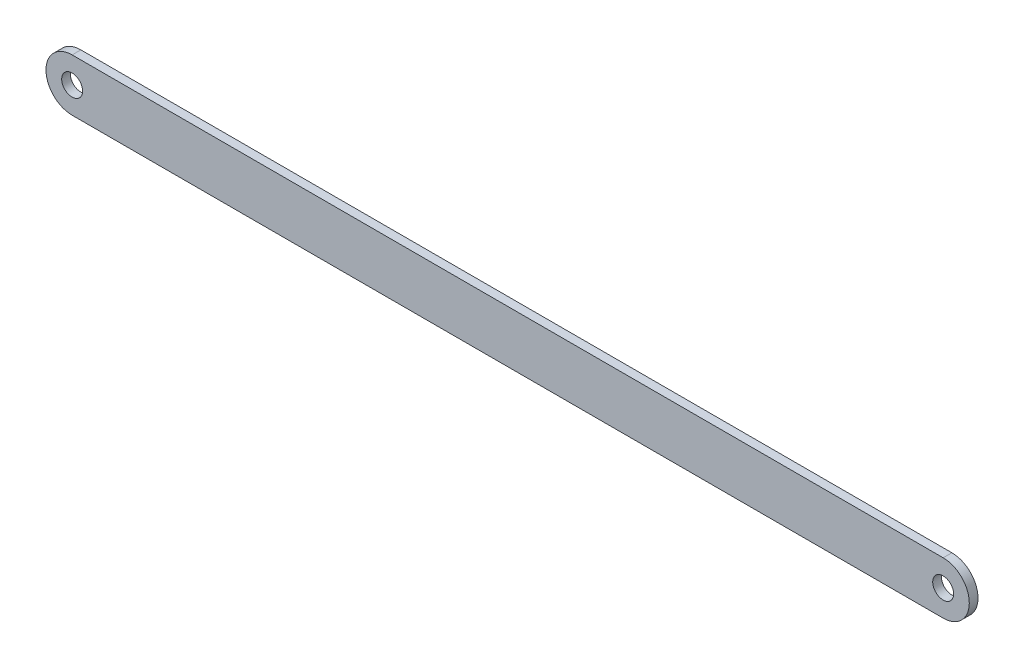
ISO-10303-21;
HEADER;
FILE_DESCRIPTION(('STEP AP214'),'2;1');
FILE_NAME('part.step','',(''),(''),'','','');
FILE_SCHEMA(('AUTOMOTIVE_DESIGN { 1 0 10303 214 1 1 1 1 }'));
ENDSEC;
DATA;
#1=APPLICATION_CONTEXT('core data for automotive mechanical design processes');
#2=APPLICATION_PROTOCOL_DEFINITION('international standard','automotive_design',2000,#1);
#3=PRODUCT_CONTEXT('',#1,'mechanical');
#4=PRODUCT('Part','Part','',(#3));
#5=PRODUCT_RELATED_PRODUCT_CATEGORY('part','',(#4));
#6=PRODUCT_DEFINITION_FORMATION('','',#4);
#7=PRODUCT_DEFINITION_CONTEXT('part definition',#1,'design');
#8=PRODUCT_DEFINITION('design','',#6,#7);
#9=PRODUCT_DEFINITION_SHAPE('','',#8);
#10=(LENGTH_UNIT() NAMED_UNIT(*) SI_UNIT(.MILLI.,.METRE.));
#11=(NAMED_UNIT(*) PLANE_ANGLE_UNIT() SI_UNIT($,.RADIAN.));
#12=(NAMED_UNIT(*) SI_UNIT($,.STERADIAN.) SOLID_ANGLE_UNIT());
#13=UNCERTAINTY_MEASURE_WITH_UNIT(LENGTH_MEASURE(1.E-05),#10,'distance_accuracy_value','');
#14=(GEOMETRIC_REPRESENTATION_CONTEXT(3) GLOBAL_UNCERTAINTY_ASSIGNED_CONTEXT((#13)) GLOBAL_UNIT_ASSIGNED_CONTEXT((#10,
#11,#12)) REPRESENTATION_CONTEXT('',''));
#15=CARTESIAN_POINT('',(0.,0.,0.));
#16=DIRECTION('',(0.,0.,1.));
#17=DIRECTION('',(1.,0.,0.));
#18=AXIS2_PLACEMENT_3D('',#15,#16,#17);
#19=CARTESIAN_POINT('',(120.,-126.,5.));
#20=DIRECTION('',(0.,0.,1.));
#21=DIRECTION('',(1.,0.,0.));
#22=AXIS2_PLACEMENT_3D('',#19,#20,#21);
#23=PLANE('',#22);
#24=CARTESIAN_POINT('',(120.,-126.,5.));
#25=DIRECTION('',(0.,0.,1.));
#26=DIRECTION('',(1.,0.,0.));
#27=AXIS2_PLACEMENT_3D('',#24,#25,#26);
#28=CIRCLE('',#27,6.00000000000002);
#29=CARTESIAN_POINT('',(126.,-126.,5.));
#30=VERTEX_POINT('',#29);
#31=EDGE_CURVE('E114',#30,#30,#28,.T.);
#32=ORIENTED_EDGE('',*,*,#31,.F.);
#33=EDGE_LOOP('',(#32));
#34=FACE_BOUND('',#33,.T.);
#35=CARTESIAN_POINT('',(120.,-126.,5.));
#36=DIRECTION('',(0.,0.,1.));
#37=DIRECTION('',(1.,0.,0.));
#38=AXIS2_PLACEMENT_3D('',#35,#36,#37);
#39=CIRCLE('',#38,15.);
#40=CARTESIAN_POINT('',(120.,-111.,5.));
#41=VERTEX_POINT('',#40);
#42=CARTESIAN_POINT('',(120.,-141.,5.));
#43=VERTEX_POINT('',#42);
#44=EDGE_CURVE('E96',#41,#43,#39,.T.);
#45=ORIENTED_EDGE('',*,*,#44,.T.);
#46=DIRECTION('',(1.,0.,0.));
#47=VECTOR('',#46,1.);
#48=CARTESIAN_POINT('',(120.,-141.,5.));
#49=LINE('',#48,#47);
#50=CARTESIAN_POINT('',(620.,-141.,5.));
#51=VERTEX_POINT('',#50);
#52=EDGE_CURVE('E91',#43,#51,#49,.T.);
#53=ORIENTED_EDGE('',*,*,#52,.T.);
#54=CARTESIAN_POINT('',(620.,-126.,5.));
#55=DIRECTION('',(0.,0.,1.));
#56=DIRECTION('',(1.,0.,0.));
#57=AXIS2_PLACEMENT_3D('',#54,#55,#56);
#58=CIRCLE('',#57,15.);
#59=CARTESIAN_POINT('',(620.,-111.,5.));
#60=VERTEX_POINT('',#59);
#61=EDGE_CURVE('E94',#51,#60,#58,.T.);
#62=ORIENTED_EDGE('',*,*,#61,.T.);
#63=DIRECTION('',(-1.,0.,0.));
#64=VECTOR('',#63,1.);
#65=CARTESIAN_POINT('',(120.,-111.,5.));
#66=LINE('',#65,#64);
#67=EDGE_CURVE('E60',#60,#41,#66,.T.);
#68=ORIENTED_EDGE('',*,*,#67,.T.);
#69=EDGE_LOOP('',(#45,#53,#62,#68));
#70=FACE_BOUND('',#69,.T.);
#71=CARTESIAN_POINT('',(620.,-126.,5.));
#72=DIRECTION('',(0.,0.,1.));
#73=DIRECTION('',(1.,0.,0.));
#74=AXIS2_PLACEMENT_3D('',#71,#72,#73);
#75=CIRCLE('',#74,5.99999999999999);
#76=CARTESIAN_POINT('',(626.,-126.,5.));
#77=VERTEX_POINT('',#76);
#78=EDGE_CURVE('E134',#77,#77,#75,.T.);
#79=ORIENTED_EDGE('',*,*,#78,.F.);
#80=EDGE_LOOP('',(#79));
#81=FACE_BOUND('',#80,.T.);
#82=ADVANCED_FACE('F39',(#34,#70,#81),#23,.T.);
#83=CARTESIAN_POINT('',(120.,-126.,0.));
#84=DIRECTION('',(0.,0.,1.));
#85=DIRECTION('',(1.,0.,0.));
#86=AXIS2_PLACEMENT_3D('',#83,#84,#85);
#87=PLANE('',#86);
#88=CARTESIAN_POINT('',(120.,-126.,0.));
#89=DIRECTION('',(0.,0.,1.));
#90=DIRECTION('',(1.,0.,0.));
#91=AXIS2_PLACEMENT_3D('',#88,#89,#90);
#92=CIRCLE('',#91,6.00000000000002);
#93=CARTESIAN_POINT('',(126.,-126.,0.));
#94=VERTEX_POINT('',#93);
#95=EDGE_CURVE('E130',#94,#94,#92,.T.);
#96=ORIENTED_EDGE('',*,*,#95,.T.);
#97=EDGE_LOOP('',(#96));
#98=FACE_BOUND('',#97,.T.);
#99=CARTESIAN_POINT('',(120.,-126.,0.));
#100=DIRECTION('',(0.,0.,1.));
#101=DIRECTION('',(1.,0.,0.));
#102=AXIS2_PLACEMENT_3D('',#99,#100,#101);
#103=CIRCLE('',#102,15.);
#104=CARTESIAN_POINT('',(120.,-111.,0.));
#105=VERTEX_POINT('',#104);
#106=CARTESIAN_POINT('',(120.,-141.,0.));
#107=VERTEX_POINT('',#106);
#108=EDGE_CURVE('E110',#105,#107,#103,.T.);
#109=ORIENTED_EDGE('',*,*,#108,.F.);
#110=DIRECTION('',(-1.,0.,0.));
#111=VECTOR('',#110,1.);
#112=CARTESIAN_POINT('',(120.,-111.,0.));
#113=LINE('',#112,#111);
#114=CARTESIAN_POINT('',(620.,-111.,0.));
#115=VERTEX_POINT('',#114);
#116=EDGE_CURVE('E83',#115,#105,#113,.T.);
#117=ORIENTED_EDGE('',*,*,#116,.F.);
#118=CARTESIAN_POINT('',(620.,-126.,0.));
#119=DIRECTION('',(0.,0.,1.));
#120=DIRECTION('',(1.,0.,0.));
#121=AXIS2_PLACEMENT_3D('',#118,#119,#120);
#122=CIRCLE('',#121,15.);
#123=CARTESIAN_POINT('',(620.,-141.,0.));
#124=VERTEX_POINT('',#123);
#125=EDGE_CURVE('E77',#124,#115,#122,.T.);
#126=ORIENTED_EDGE('',*,*,#125,.F.);
#127=DIRECTION('',(1.,0.,0.));
#128=VECTOR('',#127,1.);
#129=CARTESIAN_POINT('',(120.,-141.,0.));
#130=LINE('',#129,#128);
#131=EDGE_CURVE('E101',#107,#124,#130,.T.);
#132=ORIENTED_EDGE('',*,*,#131,.F.);
#133=EDGE_LOOP('',(#109,#117,#126,#132));
#134=FACE_BOUND('',#133,.T.);
#135=CARTESIAN_POINT('',(620.,-126.,0.));
#136=DIRECTION('',(0.,0.,1.));
#137=DIRECTION('',(1.,0.,0.));
#138=AXIS2_PLACEMENT_3D('',#135,#136,#137);
#139=CIRCLE('',#138,5.99999999999999);
#140=CARTESIAN_POINT('',(626.,-126.,0.));
#141=VERTEX_POINT('',#140);
#142=EDGE_CURVE('E138',#141,#141,#139,.T.);
#143=ORIENTED_EDGE('',*,*,#142,.T.);
#144=EDGE_LOOP('',(#143));
#145=FACE_BOUND('',#144,.T.);
#146=ADVANCED_FACE('F125',(#98,#134,#145),#87,.F.);
#147=CARTESIAN_POINT('',(120.,-126.,5.));
#148=DIRECTION('',(0.,0.,-1.));
#149=DIRECTION('',(-1.,0.,0.));
#150=AXIS2_PLACEMENT_3D('',#147,#148,#149);
#151=CYLINDRICAL_SURFACE('',#150,15.);
#152=ORIENTED_EDGE('',*,*,#108,.T.);
#153=DIRECTION('',(0.,0.,-1.));
#154=VECTOR('',#153,1.);
#155=CARTESIAN_POINT('',(120.,-141.,5.));
#156=LINE('',#155,#154);
#157=EDGE_CURVE('E11',#43,#107,#156,.T.);
#158=ORIENTED_EDGE('',*,*,#157,.F.);
#159=ORIENTED_EDGE('',*,*,#44,.F.);
#160=DIRECTION('',(0.,0.,-1.));
#161=VECTOR('',#160,1.);
#162=CARTESIAN_POINT('',(120.,-111.,5.));
#163=LINE('',#162,#161);
#164=EDGE_CURVE('E106',#41,#105,#163,.T.);
#165=ORIENTED_EDGE('',*,*,#164,.T.);
#166=EDGE_LOOP('',(#152,#158,#159,#165));
#167=FACE_BOUND('',#166,.T.);
#168=ADVANCED_FACE('F41',(#167),#151,.T.);
#169=CARTESIAN_POINT('',(120.,-141.,5.));
#170=DIRECTION('',(0.,1.,0.));
#171=DIRECTION('',(0.,0.,1.));
#172=AXIS2_PLACEMENT_3D('',#169,#170,#171);
#173=PLANE('',#172);
#174=ORIENTED_EDGE('',*,*,#131,.T.);
#175=DIRECTION('',(0.,0.,-1.));
#176=VECTOR('',#175,1.);
#177=CARTESIAN_POINT('',(620.,-141.,5.));
#178=LINE('',#177,#176);
#179=EDGE_CURVE('E49',#51,#124,#178,.T.);
#180=ORIENTED_EDGE('',*,*,#179,.F.);
#181=ORIENTED_EDGE('',*,*,#52,.F.);
#182=ORIENTED_EDGE('',*,*,#157,.T.);
#183=EDGE_LOOP('',(#174,#180,#181,#182));
#184=FACE_BOUND('',#183,.T.);
#185=ADVANCED_FACE('F100',(#184),#173,.F.);
#186=CARTESIAN_POINT('',(620.,-126.,5.));
#187=DIRECTION('',(0.,0.,-1.));
#188=DIRECTION('',(-1.,0.,0.));
#189=AXIS2_PLACEMENT_3D('',#186,#187,#188);
#190=CYLINDRICAL_SURFACE('',#189,15.);
#191=ORIENTED_EDGE('',*,*,#125,.T.);
#192=DIRECTION('',(0.,0.,-1.));
#193=VECTOR('',#192,1.);
#194=CARTESIAN_POINT('',(620.,-111.,5.));
#195=LINE('',#194,#193);
#196=EDGE_CURVE('E102',#60,#115,#195,.T.);
#197=ORIENTED_EDGE('',*,*,#196,.F.);
#198=ORIENTED_EDGE('',*,*,#61,.F.);
#199=ORIENTED_EDGE('',*,*,#179,.T.);
#200=EDGE_LOOP('',(#191,#197,#198,#199));
#201=FACE_BOUND('',#200,.T.);
#202=ADVANCED_FACE('F103',(#201),#190,.T.);
#203=CARTESIAN_POINT('',(120.,-111.,5.));
#204=DIRECTION('',(0.,-1.,0.));
#205=DIRECTION('',(0.,0.,-1.));
#206=AXIS2_PLACEMENT_3D('',#203,#204,#205);
#207=PLANE('',#206);
#208=ORIENTED_EDGE('',*,*,#116,.T.);
#209=ORIENTED_EDGE('',*,*,#164,.F.);
#210=ORIENTED_EDGE('',*,*,#67,.F.);
#211=ORIENTED_EDGE('',*,*,#196,.T.);
#212=EDGE_LOOP('',(#208,#209,#210,#211));
#213=FACE_BOUND('',#212,.T.);
#214=ADVANCED_FACE('F122',(#213),#207,.F.);
#215=CARTESIAN_POINT('',(120.,-126.,5.));
#216=DIRECTION('',(0.,0.,-1.));
#217=DIRECTION('',(-1.,0.,0.));
#218=AXIS2_PLACEMENT_3D('',#215,#216,#217);
#219=CYLINDRICAL_SURFACE('',#218,6.00000000000002);
#220=ORIENTED_EDGE('',*,*,#31,.T.);
#221=EDGE_LOOP('',(#220));
#222=FACE_BOUND('',#221,.T.);
#223=ORIENTED_EDGE('',*,*,#95,.F.);
#224=EDGE_LOOP('',(#223));
#225=FACE_BOUND('',#224,.T.);
#226=ADVANCED_FACE('F156',(#222,#225),#219,.F.);
#227=CARTESIAN_POINT('',(620.,-126.,5.));
#228=DIRECTION('',(0.,0.,-1.));
#229=DIRECTION('',(-1.,0.,0.));
#230=AXIS2_PLACEMENT_3D('',#227,#228,#229);
#231=CYLINDRICAL_SURFACE('',#230,5.99999999999999);
#232=ORIENTED_EDGE('',*,*,#78,.T.);
#233=EDGE_LOOP('',(#232));
#234=FACE_BOUND('',#233,.T.);
#235=ORIENTED_EDGE('',*,*,#142,.F.);
#236=EDGE_LOOP('',(#235));
#237=FACE_BOUND('',#236,.T.);
#238=ADVANCED_FACE('F144',(#234,#237),#231,.F.);
#239=CLOSED_SHELL('',(#82,#146,#168,#185,#202,#214,#226,#238));
#240=MANIFOLD_SOLID_BREP('B2',#239);
#241=ADVANCED_BREP_SHAPE_REPRESENTATION('',(#18,#240),#14);
#242=SHAPE_DEFINITION_REPRESENTATION(#9,#241);
ENDSEC;
END-ISO-10303-21;
